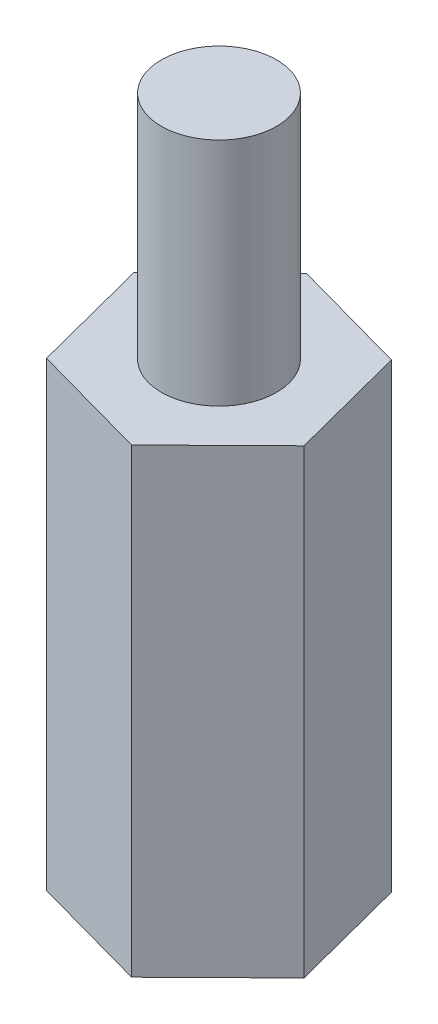
ISO-10303-21;
HEADER;
FILE_DESCRIPTION(('STEP AP214'),'2;1');
FILE_NAME('part.step','',(''),(''),'','','');
FILE_SCHEMA(('AUTOMOTIVE_DESIGN { 1 0 10303 214 1 1 1 1 }'));
ENDSEC;
DATA;
#1=APPLICATION_CONTEXT('core data for automotive mechanical design processes');
#2=APPLICATION_PROTOCOL_DEFINITION('international standard','automotive_design',2000,#1);
#3=PRODUCT_CONTEXT('',#1,'mechanical');
#4=PRODUCT('Part','Part','',(#3));
#5=PRODUCT_RELATED_PRODUCT_CATEGORY('part','',(#4));
#6=PRODUCT_DEFINITION_FORMATION('','',#4);
#7=PRODUCT_DEFINITION_CONTEXT('part definition',#1,'design');
#8=PRODUCT_DEFINITION('design','',#6,#7);
#9=PRODUCT_DEFINITION_SHAPE('','',#8);
#10=(LENGTH_UNIT() NAMED_UNIT(*) SI_UNIT(.MILLI.,.METRE.));
#11=(NAMED_UNIT(*) PLANE_ANGLE_UNIT() SI_UNIT($,.RADIAN.));
#12=(NAMED_UNIT(*) SI_UNIT($,.STERADIAN.) SOLID_ANGLE_UNIT());
#13=UNCERTAINTY_MEASURE_WITH_UNIT(LENGTH_MEASURE(1.E-05),#10,'distance_accuracy_value','');
#14=(GEOMETRIC_REPRESENTATION_CONTEXT(3) GLOBAL_UNCERTAINTY_ASSIGNED_CONTEXT((#13)) GLOBAL_UNIT_ASSIGNED_CONTEXT((#10,
#11,#12)) REPRESENTATION_CONTEXT('',''));
#15=CARTESIAN_POINT('',(0.,0.,0.));
#16=DIRECTION('',(0.,0.,1.));
#17=DIRECTION('',(1.,0.,0.));
#18=AXIS2_PLACEMENT_3D('',#15,#16,#17);
#19=CARTESIAN_POINT('',(-2.26331219006232,12.,2.227274402414));
#20=DIRECTION('',(0.266562194800756,0.,-0.963817719438174));
#21=DIRECTION('',(-0.963817719438175,0.,-0.266562194800756));
#22=AXIS2_PLACEMENT_3D('',#19,#20,#21);
#23=PLANE('',#22);
#24=DIRECTION('',(0.963817719438174,0.,0.266562194800756));
#25=VECTOR('',#24,1.);
#26=CARTESIAN_POINT('',(-2.26331219006232,0.,2.227274402414));
#27=LINE('',#26,#25);
#28=CARTESIAN_POINT('',(-2.26331219006232,0.,2.227274402414));
#29=VERTEX_POINT('',#28);
#30=CARTESIAN_POINT('',(0.797220118658163,0.,3.07372305449596));
#31=VERTEX_POINT('',#30);
#32=EDGE_CURVE('E123',#29,#31,#27,.T.);
#33=ORIENTED_EDGE('',*,*,#32,.T.);
#34=DIRECTION('',(0.,-1.,0.));
#35=VECTOR('',#34,1.);
#36=CARTESIAN_POINT('',(0.797220118658163,12.,3.07372305449596));
#37=LINE('',#36,#35);
#38=CARTESIAN_POINT('',(0.797220118658163,12.,3.07372305449596));
#39=VERTEX_POINT('',#38);
#40=EDGE_CURVE('E40',#39,#31,#37,.T.);
#41=ORIENTED_EDGE('',*,*,#40,.F.);
#42=DIRECTION('',(0.963817719438174,0.,0.266562194800756));
#43=VECTOR('',#42,1.);
#44=CARTESIAN_POINT('',(-2.26331219006232,12.,2.227274402414));
#45=LINE('',#44,#43);
#46=CARTESIAN_POINT('',(-2.26331219006232,12.,2.227274402414));
#47=VERTEX_POINT('',#46);
#48=EDGE_CURVE('E134',#47,#39,#45,.T.);
#49=ORIENTED_EDGE('',*,*,#48,.F.);
#50=DIRECTION('',(0.,-1.,0.));
#51=VECTOR('',#50,1.);
#52=CARTESIAN_POINT('',(-2.26331219006232,12.,2.227274402414));
#53=LINE('',#52,#51);
#54=EDGE_CURVE('E119',#47,#29,#53,.T.);
#55=ORIENTED_EDGE('',*,*,#54,.T.);
#56=EDGE_LOOP('',(#33,#41,#49,#55));
#57=FACE_BOUND('',#56,.T.);
#58=ADVANCED_FACE('F37',(#57),#23,.F.);
#59=CARTESIAN_POINT('',(0.797220118658163,12.,3.07372305449596));
#60=DIRECTION('',(-0.701409532250664,0.,-0.712758492105078));
#61=DIRECTION('',(-0.712758492105078,0.,0.701409532250664));
#62=AXIS2_PLACEMENT_3D('',#59,#60,#61);
#63=PLANE('',#62);
#64=DIRECTION('',(0.712758492105078,0.,-0.701409532250664));
#65=VECTOR('',#64,1.);
#66=CARTESIAN_POINT('',(0.797220118658163,0.,3.07372305449596));
#67=LINE('',#66,#65);
#68=CARTESIAN_POINT('',(3.06053230872049,0.,0.846448652081967));
#69=VERTEX_POINT('',#68);
#70=EDGE_CURVE('E126',#31,#69,#67,.T.);
#71=ORIENTED_EDGE('',*,*,#70,.T.);
#72=DIRECTION('',(0.,-1.,0.));
#73=VECTOR('',#72,1.);
#74=CARTESIAN_POINT('',(3.06053230872049,12.,0.846448652081967));
#75=LINE('',#74,#73);
#76=CARTESIAN_POINT('',(3.06053230872049,12.,0.846448652081967));
#77=VERTEX_POINT('',#76);
#78=EDGE_CURVE('E137',#77,#69,#75,.T.);
#79=ORIENTED_EDGE('',*,*,#78,.F.);
#80=DIRECTION('',(0.712758492105078,0.,-0.701409532250664));
#81=VECTOR('',#80,1.);
#82=CARTESIAN_POINT('',(0.797220118658163,12.,3.07372305449596));
#83=LINE('',#82,#81);
#84=EDGE_CURVE('E92',#39,#77,#83,.T.);
#85=ORIENTED_EDGE('',*,*,#84,.F.);
#86=ORIENTED_EDGE('',*,*,#40,.T.);
#87=EDGE_LOOP('',(#71,#79,#85,#86));
#88=FACE_BOUND('',#87,.T.);
#89=ADVANCED_FACE('F142',(#88),#63,.F.);
#90=CARTESIAN_POINT('',(3.06053230872049,12.,0.846448652081967));
#91=DIRECTION('',(-0.96797172705142,0.,0.251059227333096));
#92=DIRECTION('',(0.251059227333096,0.,0.96797172705142));
#93=AXIS2_PLACEMENT_3D('',#90,#91,#92);
#94=PLANE('',#93);
#95=DIRECTION('',(-0.251059227333096,0.,-0.96797172705142));
#96=VECTOR('',#95,1.);
#97=CARTESIAN_POINT('',(3.06053230872049,0.,0.846448652081967));
#98=LINE('',#97,#96);
#99=CARTESIAN_POINT('',(2.26331219006232,0.,-2.227274402414));
#100=VERTEX_POINT('',#99);
#101=EDGE_CURVE('E129',#69,#100,#98,.T.);
#102=ORIENTED_EDGE('',*,*,#101,.T.);
#103=DIRECTION('',(0.,-1.,0.));
#104=VECTOR('',#103,1.);
#105=CARTESIAN_POINT('',(2.26331219006232,12.,-2.227274402414));
#106=LINE('',#105,#104);
#107=CARTESIAN_POINT('',(2.26331219006232,12.,-2.227274402414));
#108=VERTEX_POINT('',#107);
#109=EDGE_CURVE('E114',#108,#100,#106,.T.);
#110=ORIENTED_EDGE('',*,*,#109,.F.);
#111=DIRECTION('',(-0.251059227333096,0.,-0.96797172705142));
#112=VECTOR('',#111,1.);
#113=CARTESIAN_POINT('',(3.06053230872049,12.,0.846448652081967));
#114=LINE('',#113,#112);
#115=EDGE_CURVE('E105',#77,#108,#114,.T.);
#116=ORIENTED_EDGE('',*,*,#115,.F.);
#117=ORIENTED_EDGE('',*,*,#78,.T.);
#118=EDGE_LOOP('',(#102,#110,#116,#117));
#119=FACE_BOUND('',#118,.T.);
#120=ADVANCED_FACE('F148',(#119),#94,.F.);
#121=CARTESIAN_POINT('',(2.26331219006232,12.,-2.227274402414));
#122=DIRECTION('',(-0.266562194800756,0.,0.963817719438174));
#123=DIRECTION('',(0.963817719438175,0.,0.266562194800756));
#124=AXIS2_PLACEMENT_3D('',#121,#122,#123);
#125=PLANE('',#124);
#126=DIRECTION('',(-0.963817719438175,0.,-0.266562194800756));
#127=VECTOR('',#126,1.);
#128=CARTESIAN_POINT('',(2.26331219006232,0.,-2.227274402414));
#129=LINE('',#128,#127);
#130=CARTESIAN_POINT('',(-0.797220118658164,0.,-3.07372305449596));
#131=VERTEX_POINT('',#130);
#132=EDGE_CURVE('E113',#100,#131,#129,.T.);
#133=ORIENTED_EDGE('',*,*,#132,.T.);
#134=DIRECTION('',(0.,-1.,0.));
#135=VECTOR('',#134,1.);
#136=CARTESIAN_POINT('',(-0.797220118658164,12.,-3.07372305449596));
#137=LINE('',#136,#135);
#138=CARTESIAN_POINT('',(-0.797220118658164,12.,-3.07372305449596));
#139=VERTEX_POINT('',#138);
#140=EDGE_CURVE('E110',#139,#131,#137,.T.);
#141=ORIENTED_EDGE('',*,*,#140,.F.);
#142=DIRECTION('',(-0.963817719438175,0.,-0.266562194800756));
#143=VECTOR('',#142,1.);
#144=CARTESIAN_POINT('',(2.26331219006232,12.,-2.227274402414));
#145=LINE('',#144,#143);
#146=EDGE_CURVE('E99',#108,#139,#145,.T.);
#147=ORIENTED_EDGE('',*,*,#146,.F.);
#148=ORIENTED_EDGE('',*,*,#109,.T.);
#149=EDGE_LOOP('',(#133,#141,#147,#148));
#150=FACE_BOUND('',#149,.T.);
#151=ADVANCED_FACE('F111',(#150),#125,.F.);
#152=CARTESIAN_POINT('',(-0.797220118658164,12.,-3.07372305449596));
#153=DIRECTION('',(0.701409532250664,0.,0.712758492105078));
#154=DIRECTION('',(0.712758492105078,0.,-0.701409532250664));
#155=AXIS2_PLACEMENT_3D('',#152,#153,#154);
#156=PLANE('',#155);
#157=DIRECTION('',(-0.712758492105078,0.,0.701409532250664));
#158=VECTOR('',#157,1.);
#159=CARTESIAN_POINT('',(-0.797220118658164,0.,-3.07372305449596));
#160=LINE('',#159,#158);
#161=CARTESIAN_POINT('',(-3.06053230872049,0.,-0.846448652081967));
#162=VERTEX_POINT('',#161);
#163=EDGE_CURVE('E77',#131,#162,#160,.T.);
#164=ORIENTED_EDGE('',*,*,#163,.T.);
#165=DIRECTION('',(0.,-1.,0.));
#166=VECTOR('',#165,1.);
#167=CARTESIAN_POINT('',(-3.06053230872049,12.,-0.846448652081967));
#168=LINE('',#167,#166);
#169=CARTESIAN_POINT('',(-3.06053230872049,12.,-0.846448652081967));
#170=VERTEX_POINT('',#169);
#171=EDGE_CURVE('E115',#170,#162,#168,.T.);
#172=ORIENTED_EDGE('',*,*,#171,.F.);
#173=DIRECTION('',(-0.712758492105078,0.,0.701409532250664));
#174=VECTOR('',#173,1.);
#175=CARTESIAN_POINT('',(-0.797220118658164,12.,-3.07372305449596));
#176=LINE('',#175,#174);
#177=EDGE_CURVE('E103',#139,#170,#176,.T.);
#178=ORIENTED_EDGE('',*,*,#177,.F.);
#179=ORIENTED_EDGE('',*,*,#140,.T.);
#180=EDGE_LOOP('',(#164,#172,#178,#179));
#181=FACE_BOUND('',#180,.T.);
#182=ADVANCED_FACE('F117',(#181),#156,.F.);
#183=CARTESIAN_POINT('',(-3.06053230872049,12.,-0.846448652081967));
#184=DIRECTION('',(0.96797172705142,0.,-0.251059227333096));
#185=DIRECTION('',(-0.251059227333096,0.,-0.96797172705142));
#186=AXIS2_PLACEMENT_3D('',#183,#184,#185);
#187=PLANE('',#186);
#188=DIRECTION('',(0.251059227333096,0.,0.96797172705142));
#189=VECTOR('',#188,1.);
#190=CARTESIAN_POINT('',(-3.06053230872049,0.,-0.846448652081967));
#191=LINE('',#190,#189);
#192=EDGE_CURVE('E83',#162,#29,#191,.T.);
#193=ORIENTED_EDGE('',*,*,#192,.T.);
#194=ORIENTED_EDGE('',*,*,#54,.F.);
#195=DIRECTION('',(0.251059227333096,0.,0.96797172705142));
#196=VECTOR('',#195,1.);
#197=CARTESIAN_POINT('',(-3.06053230872049,12.,-0.846448652081967));
#198=LINE('',#197,#196);
#199=EDGE_CURVE('E54',#170,#47,#198,.T.);
#200=ORIENTED_EDGE('',*,*,#199,.F.);
#201=ORIENTED_EDGE('',*,*,#171,.T.);
#202=EDGE_LOOP('',(#193,#194,#200,#201));
#203=FACE_BOUND('',#202,.T.);
#204=ADVANCED_FACE('F179',(#203),#187,.F.);
#205=CARTESIAN_POINT('',(0.,12.,0.));
#206=DIRECTION('',(0.,1.,0.));
#207=DIRECTION('',(0.,0.,1.));
#208=AXIS2_PLACEMENT_3D('',#205,#206,#207);
#209=PLANE('',#208);
#210=CARTESIAN_POINT('',(0.,12.,0.));
#211=DIRECTION('',(0.,1.,0.));
#212=DIRECTION('',(0.,0.,1.));
#213=AXIS2_PLACEMENT_3D('',#210,#211,#212);
#214=CIRCLE('',#213,1.5);
#215=CARTESIAN_POINT('',(0.,12.,1.5));
#216=VERTEX_POINT('',#215);
#217=EDGE_CURVE('E11',#216,#216,#214,.T.);
#218=ORIENTED_EDGE('',*,*,#217,.F.);
#219=EDGE_LOOP('',(#218));
#220=FACE_BOUND('',#219,.T.);
#221=ORIENTED_EDGE('',*,*,#48,.T.);
#222=ORIENTED_EDGE('',*,*,#84,.T.);
#223=ORIENTED_EDGE('',*,*,#115,.T.);
#224=ORIENTED_EDGE('',*,*,#146,.T.);
#225=ORIENTED_EDGE('',*,*,#177,.T.);
#226=ORIENTED_EDGE('',*,*,#199,.T.);
#227=EDGE_LOOP('',(#221,#222,#223,#224,#225,#226));
#228=FACE_BOUND('',#227,.T.);
#229=ADVANCED_FACE('F101',(#220,#228),#209,.T.);
#230=CARTESIAN_POINT('',(0.,0.,0.));
#231=DIRECTION('',(0.,1.,0.));
#232=DIRECTION('',(0.,0.,1.));
#233=AXIS2_PLACEMENT_3D('',#230,#231,#232);
#234=PLANE('',#233);
#235=CARTESIAN_POINT('',(0.,0.,0.));
#236=DIRECTION('',(0.,-1.,0.));
#237=DIRECTION('',(0.,0.,-1.));
#238=AXIS2_PLACEMENT_3D('',#235,#236,#237);
#239=CIRCLE('',#238,1.5);
#240=CARTESIAN_POINT('',(0.,0.,-1.5));
#241=VERTEX_POINT('',#240);
#242=EDGE_CURVE('E155',#241,#241,#239,.T.);
#243=ORIENTED_EDGE('',*,*,#242,.F.);
#244=EDGE_LOOP('',(#243));
#245=FACE_BOUND('',#244,.T.);
#246=ORIENTED_EDGE('',*,*,#32,.F.);
#247=ORIENTED_EDGE('',*,*,#192,.F.);
#248=ORIENTED_EDGE('',*,*,#163,.F.);
#249=ORIENTED_EDGE('',*,*,#132,.F.);
#250=ORIENTED_EDGE('',*,*,#101,.F.);
#251=ORIENTED_EDGE('',*,*,#70,.F.);
#252=EDGE_LOOP('',(#246,#247,#248,#249,#250,#251));
#253=FACE_BOUND('',#252,.T.);
#254=ADVANCED_FACE('F147',(#245,#253),#234,.F.);
#255=CARTESIAN_POINT('',(0.,18.,0.));
#256=DIRECTION('',(0.,-1.,0.));
#257=DIRECTION('',(0.,0.,-1.));
#258=AXIS2_PLACEMENT_3D('',#255,#256,#257);
#259=CYLINDRICAL_SURFACE('',#258,1.5);
#260=CARTESIAN_POINT('',(0.,18.,0.));
#261=DIRECTION('',(0.,1.,0.));
#262=DIRECTION('',(0.,0.,1.));
#263=AXIS2_PLACEMENT_3D('',#260,#261,#262);
#264=CIRCLE('',#263,1.5);
#265=CARTESIAN_POINT('',(0.,18.,1.5));
#266=VERTEX_POINT('',#265);
#267=EDGE_CURVE('E127',#266,#266,#264,.T.);
#268=ORIENTED_EDGE('',*,*,#267,.F.);
#269=EDGE_LOOP('',(#268));
#270=FACE_BOUND('',#269,.T.);
#271=ORIENTED_EDGE('',*,*,#217,.T.);
#272=EDGE_LOOP('',(#271));
#273=FACE_BOUND('',#272,.T.);
#274=ADVANCED_FACE('F171',(#270,#273),#259,.T.);
#275=CARTESIAN_POINT('',(0.,18.,0.));
#276=DIRECTION('',(0.,1.,0.));
#277=DIRECTION('',(0.,0.,1.));
#278=AXIS2_PLACEMENT_3D('',#275,#276,#277);
#279=PLANE('',#278);
#280=ORIENTED_EDGE('',*,*,#267,.T.);
#281=EDGE_LOOP('',(#280));
#282=FACE_BOUND('',#281,.T.);
#283=ADVANCED_FACE('F166',(#282),#279,.T.);
#284=CARTESIAN_POINT('',(0.,6.,0.));
#285=DIRECTION('',(0.,-1.,0.));
#286=DIRECTION('',(0.,0.,-1.));
#287=AXIS2_PLACEMENT_3D('',#284,#285,#286);
#288=CYLINDRICAL_SURFACE('',#287,1.5);
#289=CARTESIAN_POINT('',(0.,6.,0.));
#290=DIRECTION('',(0.,-1.,0.));
#291=DIRECTION('',(0.,0.,-1.));
#292=AXIS2_PLACEMENT_3D('',#289,#290,#291);
#293=CIRCLE('',#292,1.5);
#294=CARTESIAN_POINT('',(0.,6.,-1.5));
#295=VERTEX_POINT('',#294);
#296=EDGE_CURVE('E154',#295,#295,#293,.T.);
#297=ORIENTED_EDGE('',*,*,#296,.F.);
#298=EDGE_LOOP('',(#297));
#299=FACE_BOUND('',#298,.T.);
#300=ORIENTED_EDGE('',*,*,#242,.T.);
#301=EDGE_LOOP('',(#300));
#302=FACE_BOUND('',#301,.T.);
#303=ADVANCED_FACE('F163',(#299,#302),#288,.F.);
#304=CARTESIAN_POINT('',(0.,6.,0.));
#305=DIRECTION('',(0.,-1.,0.));
#306=DIRECTION('',(0.,0.,-1.));
#307=AXIS2_PLACEMENT_3D('',#304,#305,#306);
#308=PLANE('',#307);
#309=ORIENTED_EDGE('',*,*,#296,.T.);
#310=EDGE_LOOP('',(#309));
#311=FACE_BOUND('',#310,.T.);
#312=ADVANCED_FACE('F161',(#311),#308,.T.);
#313=CLOSED_SHELL('',(#58,#89,#120,#151,#182,#204,#229,#254,#274,#283,#303,#312));
#314=MANIFOLD_SOLID_BREP('B2',#313);
#315=ADVANCED_BREP_SHAPE_REPRESENTATION('',(#18,#314),#14);
#316=SHAPE_DEFINITION_REPRESENTATION(#9,#315);
ENDSEC;
END-ISO-10303-21;
